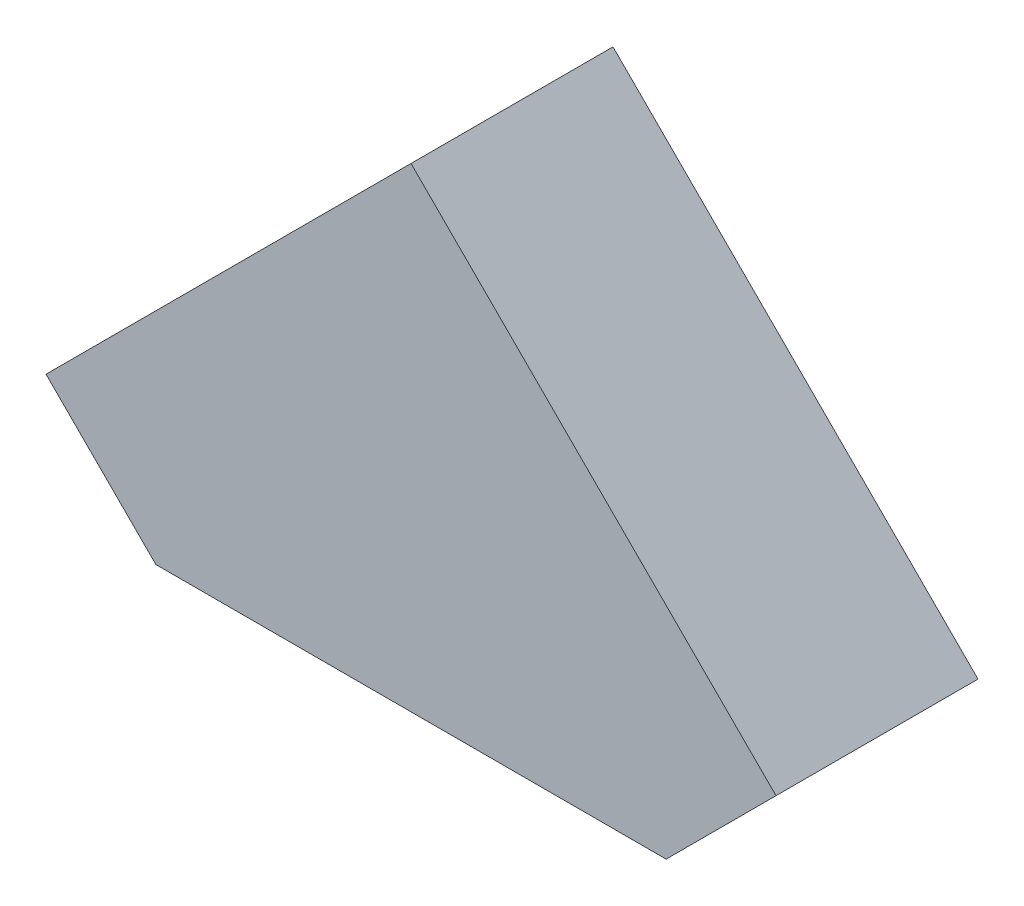
ISO-10303-21;
HEADER;
FILE_DESCRIPTION(('STEP AP214'),'2;1');
FILE_NAME('part.step','',(''),(''),'','','');
FILE_SCHEMA(('AUTOMOTIVE_DESIGN { 1 0 10303 214 1 1 1 1 }'));
ENDSEC;
DATA;
#1=APPLICATION_CONTEXT('core data for automotive mechanical design processes');
#2=APPLICATION_PROTOCOL_DEFINITION('international standard','automotive_design',2000,#1);
#3=PRODUCT_CONTEXT('',#1,'mechanical');
#4=PRODUCT('Part','Part','',(#3));
#5=PRODUCT_RELATED_PRODUCT_CATEGORY('part','',(#4));
#6=PRODUCT_DEFINITION_FORMATION('','',#4);
#7=PRODUCT_DEFINITION_CONTEXT('part definition',#1,'design');
#8=PRODUCT_DEFINITION('design','',#6,#7);
#9=PRODUCT_DEFINITION_SHAPE('','',#8);
#10=(LENGTH_UNIT() NAMED_UNIT(*) SI_UNIT(.MILLI.,.METRE.));
#11=(NAMED_UNIT(*) PLANE_ANGLE_UNIT() SI_UNIT($,.RADIAN.));
#12=(NAMED_UNIT(*) SI_UNIT($,.STERADIAN.) SOLID_ANGLE_UNIT());
#13=UNCERTAINTY_MEASURE_WITH_UNIT(LENGTH_MEASURE(1.E-05),#10,'distance_accuracy_value','');
#14=(GEOMETRIC_REPRESENTATION_CONTEXT(3) GLOBAL_UNCERTAINTY_ASSIGNED_CONTEXT((#13)) GLOBAL_UNIT_ASSIGNED_CONTEXT((#10,
#11,#12)) REPRESENTATION_CONTEXT('',''));
#15=CARTESIAN_POINT('',(0.,0.,0.));
#16=DIRECTION('',(0.,0.,1.));
#17=DIRECTION('',(1.,0.,0.));
#18=AXIS2_PLACEMENT_3D('',#15,#16,#17);
#19=CARTESIAN_POINT('',(-24.1507472573498,-6.97057308620988,-12.75));
#20=DIRECTION('',(-0.707106781186547,-0.707106781186548,0.));
#21=DIRECTION('',(0.707106781186548,-0.707106781186547,0.));
#22=AXIS2_PLACEMENT_3D('',#19,#20,#21);
#23=PLANE('',#22);
#24=DIRECTION('',(-0.707106781186548,0.707106781186547,0.));
#25=VECTOR('',#24,1.);
#26=CARTESIAN_POINT('',(-24.1507472573498,-6.97057308620988,0.));
#27=LINE('',#26,#25);
#28=CARTESIAN_POINT('',(-17.6213203435596,-13.5,0.));
#29=VERTEX_POINT('',#28);
#30=CARTESIAN_POINT('',(-25.2114074291296,-5.90991291443006,0.));
#31=VERTEX_POINT('',#30);
#32=EDGE_CURVE('E196',#29,#31,#27,.T.);
#33=ORIENTED_EDGE('',*,*,#32,.F.);
#34=DIRECTION('',(0.,0.,1.));
#35=VECTOR('',#34,1.);
#36=CARTESIAN_POINT('',(-17.6213203435596,-13.5,-12.75));
#37=LINE('',#36,#35);
#38=CARTESIAN_POINT('',(-17.6213203435596,-13.5,13.95));
#39=VERTEX_POINT('',#38);
#40=EDGE_CURVE('E209',#29,#39,#37,.T.);
#41=ORIENTED_EDGE('',*,*,#40,.T.);
#42=DIRECTION('',(0.707106781186548,-0.707106781186547,0.));
#43=VECTOR('',#42,1.);
#44=CARTESIAN_POINT('',(-25.2114074291296,-5.90991291443006,13.95));
#45=LINE('',#44,#43);
#46=CARTESIAN_POINT('',(-25.2114074291296,-5.90991291443006,13.95));
#47=VERTEX_POINT('',#46);
#48=EDGE_CURVE('E253',#47,#39,#45,.T.);
#49=ORIENTED_EDGE('',*,*,#48,.F.);
#50=DIRECTION('',(0.,0.,1.));
#51=VECTOR('',#50,1.);
#52=CARTESIAN_POINT('',(-25.2114074291296,-5.90991291443006,-12.75));
#53=LINE('',#52,#51);
#54=EDGE_CURVE('E102',#31,#47,#53,.T.);
#55=ORIENTED_EDGE('',*,*,#54,.F.);
#56=EDGE_LOOP('',(#33,#41,#49,#55));
#57=FACE_BOUND('',#56,.T.);
#58=ADVANCED_FACE('F95',(#57),#23,.T.);
#59=CARTESIAN_POINT('',(-1.06066017177982,18.2408343429197,-12.75));
#60=DIRECTION('',(-0.707106781186548,0.707106781186547,0.));
#61=DIRECTION('',(-0.707106781186547,-0.707106781186548,0.));
#62=AXIS2_PLACEMENT_3D('',#59,#60,#61);
#63=PLANE('',#62);
#64=DIRECTION('',(0.707106781186547,0.707106781186548,0.));
#65=VECTOR('',#64,1.);
#66=CARTESIAN_POINT('',(-1.06066017177982,18.2408343429197,0.));
#67=LINE('',#66,#65);
#68=CARTESIAN_POINT('',(0.,19.3014945146996,0.));
#69=VERTEX_POINT('',#68);
#70=EDGE_CURVE('E212',#31,#69,#67,.T.);
#71=ORIENTED_EDGE('',*,*,#70,.F.);
#72=ORIENTED_EDGE('',*,*,#54,.T.);
#73=DIRECTION('',(-0.707106781186547,-0.707106781186548,0.));
#74=VECTOR('',#73,1.);
#75=CARTESIAN_POINT('',(0.,19.3014945146996,13.95));
#76=LINE('',#75,#74);
#77=CARTESIAN_POINT('',(0.,19.3014945146996,13.95));
#78=VERTEX_POINT('',#77);
#79=EDGE_CURVE('E255',#78,#47,#76,.T.);
#80=ORIENTED_EDGE('',*,*,#79,.F.);
#81=DIRECTION('',(0.,0.,1.));
#82=VECTOR('',#81,1.);
#83=CARTESIAN_POINT('',(0.,19.3014945146996,-12.75));
#84=LINE('',#83,#82);
#85=EDGE_CURVE('E227',#69,#78,#84,.T.);
#86=ORIENTED_EDGE('',*,*,#85,.F.);
#87=EDGE_LOOP('',(#71,#72,#80,#86));
#88=FACE_BOUND('',#87,.T.);
#89=ADVANCED_FACE('F313',(#88),#63,.T.);
#90=CARTESIAN_POINT('',(24.1507472573498,-4.84925274265025,-12.75));
#91=DIRECTION('',(0.707106781186548,0.707106781186547,0.));
#92=DIRECTION('',(-0.707106781186547,0.707106781186548,0.));
#93=AXIS2_PLACEMENT_3D('',#90,#91,#92);
#94=PLANE('',#93);
#95=DIRECTION('',(0.707106781186547,-0.707106781186548,0.));
#96=VECTOR('',#95,1.);
#97=CARTESIAN_POINT('',(24.1507472573498,-4.84925274265025,0.));
#98=LINE('',#97,#96);
#99=CARTESIAN_POINT('',(25.2114074291296,-5.90991291443007,0.));
#100=VERTEX_POINT('',#99);
#101=EDGE_CURVE('E282',#69,#100,#98,.T.);
#102=ORIENTED_EDGE('',*,*,#101,.F.);
#103=ORIENTED_EDGE('',*,*,#85,.T.);
#104=DIRECTION('',(-0.707106781186547,0.707106781186548,0.));
#105=VECTOR('',#104,1.);
#106=CARTESIAN_POINT('',(25.2114074291296,-5.90991291443007,13.95));
#107=LINE('',#106,#105);
#108=CARTESIAN_POINT('',(25.2114074291296,-5.90991291443007,13.95));
#109=VERTEX_POINT('',#108);
#110=EDGE_CURVE('E258',#109,#78,#107,.T.);
#111=ORIENTED_EDGE('',*,*,#110,.F.);
#112=DIRECTION('',(0.,0.,1.));
#113=VECTOR('',#112,1.);
#114=CARTESIAN_POINT('',(25.2114074291296,-5.90991291443007,-12.75));
#115=LINE('',#114,#113);
#116=EDGE_CURVE('E221',#100,#109,#115,.T.);
#117=ORIENTED_EDGE('',*,*,#116,.F.);
#118=EDGE_LOOP('',(#102,#103,#111,#117));
#119=FACE_BOUND('',#118,.T.);
#120=ADVANCED_FACE('F316',(#119),#94,.T.);
#121=CARTESIAN_POINT('',(18.0606601717798,-13.0606601717798,-12.75));
#122=DIRECTION('',(0.707106781186546,-0.707106781186549,0.));
#123=DIRECTION('',(0.707106781186549,0.707106781186546,0.));
#124=AXIS2_PLACEMENT_3D('',#121,#122,#123);
#125=PLANE('',#124);
#126=DIRECTION('',(-0.707106781186549,-0.707106781186546,0.));
#127=VECTOR('',#126,1.);
#128=CARTESIAN_POINT('',(18.0606601717798,-13.0606601717798,0.));
#129=LINE('',#128,#127);
#130=CARTESIAN_POINT('',(17.6213203435596,-13.5,0.));
#131=VERTEX_POINT('',#130);
#132=EDGE_CURVE('E284',#100,#131,#129,.T.);
#133=ORIENTED_EDGE('',*,*,#132,.F.);
#134=ORIENTED_EDGE('',*,*,#116,.T.);
#135=DIRECTION('',(0.707106781186549,0.707106781186546,0.));
#136=VECTOR('',#135,1.);
#137=CARTESIAN_POINT('',(17.6213203435596,-13.5,13.95));
#138=LINE('',#137,#136);
#139=CARTESIAN_POINT('',(17.6213203435596,-13.5,13.95));
#140=VERTEX_POINT('',#139);
#141=EDGE_CURVE('E261',#140,#109,#138,.T.);
#142=ORIENTED_EDGE('',*,*,#141,.F.);
#143=DIRECTION('',(0.,0.,1.));
#144=VECTOR('',#143,1.);
#145=CARTESIAN_POINT('',(17.6213203435596,-13.5,-12.75));
#146=LINE('',#145,#144);
#147=EDGE_CURVE('E219',#131,#140,#146,.T.);
#148=ORIENTED_EDGE('',*,*,#147,.F.);
#149=EDGE_LOOP('',(#133,#134,#142,#148));
#150=FACE_BOUND('',#149,.T.);
#151=ADVANCED_FACE('F305',(#150),#125,.T.);
#152=CARTESIAN_POINT('',(-17.,-13.5,-12.75));
#153=DIRECTION('',(0.,-1.,0.));
#154=DIRECTION('',(0.,0.,-1.));
#155=AXIS2_PLACEMENT_3D('',#152,#153,#154);
#156=PLANE('',#155);
#157=DIRECTION('',(1.,0.,0.));
#158=VECTOR('',#157,1.);
#159=CARTESIAN_POINT('',(-25.2114074291296,-13.5,0.));
#160=LINE('',#159,#158);
#161=CARTESIAN_POINT('',(11.8,-13.5,0.));
#162=VERTEX_POINT('',#161);
#163=EDGE_CURVE('E204',#162,#131,#160,.T.);
#164=ORIENTED_EDGE('',*,*,#163,.T.);
#165=ORIENTED_EDGE('',*,*,#147,.T.);
#166=DIRECTION('',(1.,0.,0.));
#167=VECTOR('',#166,1.);
#168=CARTESIAN_POINT('',(-17.6213203435596,-13.5,13.95));
#169=LINE('',#168,#167);
#170=EDGE_CURVE('E218',#39,#140,#169,.T.);
#171=ORIENTED_EDGE('',*,*,#170,.F.);
#172=ORIENTED_EDGE('',*,*,#40,.F.);
#173=CARTESIAN_POINT('',(-11.8,-13.5,0.));
#174=VERTEX_POINT('',#173);
#175=EDGE_CURVE('E193',#29,#174,#160,.T.);
#176=ORIENTED_EDGE('',*,*,#175,.T.);
#177=DIRECTION('',(0.,0.,-1.));
#178=VECTOR('',#177,1.);
#179=CARTESIAN_POINT('',(-11.8,-13.5,11.8));
#180=LINE('',#179,#178);
#181=CARTESIAN_POINT('',(-11.8,-13.5,11.8));
#182=VERTEX_POINT('',#181);
#183=EDGE_CURVE('E271',#182,#174,#180,.T.);
#184=ORIENTED_EDGE('',*,*,#183,.F.);
#185=DIRECTION('',(-1.,0.,0.));
#186=VECTOR('',#185,1.);
#187=CARTESIAN_POINT('',(-11.8,-13.5,11.8));
#188=LINE('',#187,#186);
#189=CARTESIAN_POINT('',(11.8,-13.5,11.8));
#190=VERTEX_POINT('',#189);
#191=EDGE_CURVE('E274',#190,#182,#188,.T.);
#192=ORIENTED_EDGE('',*,*,#191,.F.);
#193=DIRECTION('',(0.,0.,1.));
#194=VECTOR('',#193,1.);
#195=CARTESIAN_POINT('',(11.8,-13.5,11.8));
#196=LINE('',#195,#194);
#197=EDGE_CURVE('E211',#162,#190,#196,.T.);
#198=ORIENTED_EDGE('',*,*,#197,.F.);
#199=EDGE_LOOP('',(#164,#165,#171,#172,#176,#184,#192,#198));
#200=FACE_BOUND('',#199,.T.);
#201=ADVANCED_FACE('F216',(#200),#156,.T.);
#202=CARTESIAN_POINT('',(0.,0.,13.95));
#203=DIRECTION('',(0.,0.,1.));
#204=DIRECTION('',(1.,0.,0.));
#205=AXIS2_PLACEMENT_3D('',#202,#203,#204);
#206=PLANE('',#205);
#207=ORIENTED_EDGE('',*,*,#141,.T.);
#208=ORIENTED_EDGE('',*,*,#110,.T.);
#209=ORIENTED_EDGE('',*,*,#79,.T.);
#210=ORIENTED_EDGE('',*,*,#48,.T.);
#211=ORIENTED_EDGE('',*,*,#170,.T.);
#212=EDGE_LOOP('',(#207,#208,#209,#210,#211));
#213=FACE_BOUND('',#212,.T.);
#214=ADVANCED_FACE('F309',(#213),#206,.T.);
#215=CARTESIAN_POINT('',(11.8,21.375440072005,11.8));
#216=DIRECTION('',(1.,0.,0.));
#217=DIRECTION('',(0.,0.,-1.));
#218=AXIS2_PLACEMENT_3D('',#215,#216,#217);
#219=PLANE('',#218);
#220=DIRECTION('',(0.,0.,-1.));
#221=VECTOR('',#220,1.);
#222=CARTESIAN_POINT('',(11.8,-12.,11.8));
#223=LINE('',#222,#221);
#224=CARTESIAN_POINT('',(11.8,-12.,11.8));
#225=VERTEX_POINT('',#224);
#226=CARTESIAN_POINT('',(11.8,-12.,0.));
#227=VERTEX_POINT('',#226);
#228=EDGE_CURVE('E266',#225,#227,#223,.T.);
#229=ORIENTED_EDGE('',*,*,#228,.T.);
#230=DIRECTION('',(0.,-1.,0.));
#231=VECTOR('',#230,1.);
#232=CARTESIAN_POINT('',(11.8,21.375440072005,0.));
#233=LINE('',#232,#231);
#234=EDGE_CURVE('E286',#227,#162,#233,.T.);
#235=ORIENTED_EDGE('',*,*,#234,.T.);
#236=ORIENTED_EDGE('',*,*,#197,.T.);
#237=DIRECTION('',(0.,-1.,0.));
#238=VECTOR('',#237,1.);
#239=CARTESIAN_POINT('',(11.8,21.375440072005,11.8));
#240=LINE('',#239,#238);
#241=EDGE_CURVE('E267',#225,#190,#240,.T.);
#242=ORIENTED_EDGE('',*,*,#241,.F.);
#243=EDGE_LOOP('',(#229,#235,#236,#242));
#244=FACE_BOUND('',#243,.T.);
#245=ADVANCED_FACE('F368',(#244),#219,.F.);
#246=CARTESIAN_POINT('',(-11.8,21.375440072005,11.8));
#247=DIRECTION('',(-1.,0.,0.));
#248=DIRECTION('',(0.,0.,1.));
#249=AXIS2_PLACEMENT_3D('',#246,#247,#248);
#250=PLANE('',#249);
#251=ORIENTED_EDGE('',*,*,#183,.T.);
#252=DIRECTION('',(0.,1.,0.));
#253=VECTOR('',#252,1.);
#254=CARTESIAN_POINT('',(-11.8,21.375440072005,0.));
#255=LINE('',#254,#253);
#256=CARTESIAN_POINT('',(-11.8,-12.,0.));
#257=VERTEX_POINT('',#256);
#258=EDGE_CURVE('E198',#174,#257,#255,.T.);
#259=ORIENTED_EDGE('',*,*,#258,.T.);
#260=DIRECTION('',(0.,0.,1.));
#261=VECTOR('',#260,1.);
#262=CARTESIAN_POINT('',(-11.8,-12.,11.8));
#263=LINE('',#262,#261);
#264=CARTESIAN_POINT('',(-11.8,-12.,11.8));
#265=VERTEX_POINT('',#264);
#266=EDGE_CURVE('E116',#257,#265,#263,.T.);
#267=ORIENTED_EDGE('',*,*,#266,.T.);
#268=DIRECTION('',(0.,-1.,0.));
#269=VECTOR('',#268,1.);
#270=CARTESIAN_POINT('',(-11.8,21.375440072005,11.8));
#271=LINE('',#270,#269);
#272=EDGE_CURVE('E270',#265,#182,#271,.T.);
#273=ORIENTED_EDGE('',*,*,#272,.T.);
#274=EDGE_LOOP('',(#251,#259,#267,#273));
#275=FACE_BOUND('',#274,.T.);
#276=ADVANCED_FACE('F376',(#275),#250,.F.);
#277=CARTESIAN_POINT('',(-11.8,21.375440072005,11.8));
#278=DIRECTION('',(0.,0.,1.));
#279=DIRECTION('',(1.,0.,0.));
#280=AXIS2_PLACEMENT_3D('',#277,#278,#279);
#281=PLANE('',#280);
#282=DIRECTION('',(1.,0.,0.));
#283=VECTOR('',#282,1.);
#284=CARTESIAN_POINT('',(-11.8,-12.,11.8));
#285=LINE('',#284,#283);
#286=EDGE_CURVE('E264',#265,#225,#285,.T.);
#287=ORIENTED_EDGE('',*,*,#286,.T.);
#288=ORIENTED_EDGE('',*,*,#241,.T.);
#289=ORIENTED_EDGE('',*,*,#191,.T.);
#290=ORIENTED_EDGE('',*,*,#272,.F.);
#291=EDGE_LOOP('',(#287,#288,#289,#290));
#292=FACE_BOUND('',#291,.T.);
#293=ADVANCED_FACE('F332',(#292),#281,.F.);
#294=CARTESIAN_POINT('',(-17.,-12.,-12.75));
#295=DIRECTION('',(0.,-1.,0.));
#296=DIRECTION('',(0.,0.,-1.));
#297=AXIS2_PLACEMENT_3D('',#294,#295,#296);
#298=PLANE('',#297);
#299=DIRECTION('',(0.,0.,1.));
#300=VECTOR('',#299,1.);
#301=CARTESIAN_POINT('',(17.,-12.,-12.75));
#302=LINE('',#301,#300);
#303=CARTESIAN_POINT('',(17.,-12.,0.));
#304=VERTEX_POINT('',#303);
#305=CARTESIAN_POINT('',(17.,-12.,12.75));
#306=VERTEX_POINT('',#305);
#307=EDGE_CURVE('E232',#304,#306,#302,.T.);
#308=ORIENTED_EDGE('',*,*,#307,.F.);
#309=DIRECTION('',(-1.,0.,0.));
#310=VECTOR('',#309,1.);
#311=CARTESIAN_POINT('',(-17.,-12.,0.));
#312=LINE('',#311,#310);
#313=EDGE_CURVE('E289',#304,#227,#312,.T.);
#314=ORIENTED_EDGE('',*,*,#313,.T.);
#315=ORIENTED_EDGE('',*,*,#228,.F.);
#316=ORIENTED_EDGE('',*,*,#286,.F.);
#317=ORIENTED_EDGE('',*,*,#266,.F.);
#318=CARTESIAN_POINT('',(-17.,-12.,0.));
#319=VERTEX_POINT('',#318);
#320=EDGE_CURVE('E294',#257,#319,#312,.T.);
#321=ORIENTED_EDGE('',*,*,#320,.T.);
#322=DIRECTION('',(0.,0.,1.));
#323=VECTOR('',#322,1.);
#324=CARTESIAN_POINT('',(-17.,-12.,-12.75));
#325=LINE('',#324,#323);
#326=CARTESIAN_POINT('',(-17.,-12.,12.75));
#327=VERTEX_POINT('',#326);
#328=EDGE_CURVE('E230',#319,#327,#325,.T.);
#329=ORIENTED_EDGE('',*,*,#328,.T.);
#330=DIRECTION('',(1.,0.,0.));
#331=VECTOR('',#330,1.);
#332=CARTESIAN_POINT('',(-17.,-12.,12.75));
#333=LINE('',#332,#331);
#334=EDGE_CURVE('E246',#327,#306,#333,.T.);
#335=ORIENTED_EDGE('',*,*,#334,.T.);
#336=EDGE_LOOP('',(#308,#314,#315,#316,#317,#321,#329,#335));
#337=FACE_BOUND('',#336,.T.);
#338=ADVANCED_FACE('F392',(#337),#298,.F.);
#339=CARTESIAN_POINT('',(0.,0.,12.75));
#340=DIRECTION('',(0.,0.,1.));
#341=DIRECTION('',(1.,0.,0.));
#342=AXIS2_PLACEMENT_3D('',#339,#340,#341);
#343=PLANE('',#342);
#344=ORIENTED_EDGE('',*,*,#334,.F.);
#345=DIRECTION('',(0.707106781186548,-0.707106781186547,0.));
#346=VECTOR('',#345,1.);
#347=CARTESIAN_POINT('',(-23.09008708557,-5.90991291443006,12.75));
#348=LINE('',#347,#346);
#349=CARTESIAN_POINT('',(-23.09008708557,-5.90991291443006,12.75));
#350=VERTEX_POINT('',#349);
#351=EDGE_CURVE('E249',#350,#327,#348,.T.);
#352=ORIENTED_EDGE('',*,*,#351,.F.);
#353=DIRECTION('',(-0.707106781186547,-0.707106781186548,0.));
#354=VECTOR('',#353,1.);
#355=CARTESIAN_POINT('',(0.,17.1801741711399,12.75));
#356=LINE('',#355,#354);
#357=CARTESIAN_POINT('',(0.,17.1801741711399,12.75));
#358=VERTEX_POINT('',#357);
#359=EDGE_CURVE('E233',#358,#350,#356,.T.);
#360=ORIENTED_EDGE('',*,*,#359,.F.);
#361=DIRECTION('',(-0.707106781186547,0.707106781186548,0.));
#362=VECTOR('',#361,1.);
#363=CARTESIAN_POINT('',(23.09008708557,-5.90991291443007,12.75));
#364=LINE('',#363,#362);
#365=CARTESIAN_POINT('',(23.09008708557,-5.90991291443007,12.75));
#366=VERTEX_POINT('',#365);
#367=EDGE_CURVE('E240',#366,#358,#364,.T.);
#368=ORIENTED_EDGE('',*,*,#367,.F.);
#369=DIRECTION('',(0.707106781186549,0.707106781186546,0.));
#370=VECTOR('',#369,1.);
#371=CARTESIAN_POINT('',(17.,-12.,12.75));
#372=LINE('',#371,#370);
#373=EDGE_CURVE('E243',#306,#366,#372,.T.);
#374=ORIENTED_EDGE('',*,*,#373,.F.);
#375=EDGE_LOOP('',(#344,#352,#360,#368,#374));
#376=FACE_BOUND('',#375,.T.);
#377=ADVANCED_FACE('F397',(#376),#343,.F.);
#378=CARTESIAN_POINT('',(23.09008708557,-5.90991291443007,-12.75));
#379=DIRECTION('',(0.707106781186548,0.707106781186547,0.));
#380=DIRECTION('',(-0.707106781186547,0.707106781186548,0.));
#381=AXIS2_PLACEMENT_3D('',#378,#379,#380);
#382=PLANE('',#381);
#383=DIRECTION('',(0.,0.,1.));
#384=VECTOR('',#383,1.);
#385=CARTESIAN_POINT('',(0.,17.1801741711399,-12.75));
#386=LINE('',#385,#384);
#387=CARTESIAN_POINT('',(0.,17.1801741711399,0.));
#388=VERTEX_POINT('',#387);
#389=EDGE_CURVE('E223',#388,#358,#386,.T.);
#390=ORIENTED_EDGE('',*,*,#389,.F.);
#391=DIRECTION('',(0.707106781186547,-0.707106781186548,0.));
#392=VECTOR('',#391,1.);
#393=CARTESIAN_POINT('',(23.09008708557,-5.90991291443007,0.));
#394=LINE('',#393,#392);
#395=CARTESIAN_POINT('',(23.09008708557,-5.90991291443007,0.));
#396=VERTEX_POINT('',#395);
#397=EDGE_CURVE('E109',#388,#396,#394,.T.);
#398=ORIENTED_EDGE('',*,*,#397,.T.);
#399=DIRECTION('',(0.,0.,1.));
#400=VECTOR('',#399,1.);
#401=CARTESIAN_POINT('',(23.09008708557,-5.90991291443007,-12.75));
#402=LINE('',#401,#400);
#403=EDGE_CURVE('E235',#396,#366,#402,.T.);
#404=ORIENTED_EDGE('',*,*,#403,.T.);
#405=ORIENTED_EDGE('',*,*,#367,.T.);
#406=EDGE_LOOP('',(#390,#398,#404,#405));
#407=FACE_BOUND('',#406,.T.);
#408=ADVANCED_FACE('F406',(#407),#382,.F.);
#409=CARTESIAN_POINT('',(17.,-12.,-12.75));
#410=DIRECTION('',(0.707106781186546,-0.707106781186549,0.));
#411=DIRECTION('',(0.707106781186549,0.707106781186546,0.));
#412=AXIS2_PLACEMENT_3D('',#409,#410,#411);
#413=PLANE('',#412);
#414=ORIENTED_EDGE('',*,*,#403,.F.);
#415=DIRECTION('',(-0.707106781186549,-0.707106781186546,0.));
#416=VECTOR('',#415,1.);
#417=CARTESIAN_POINT('',(17.,-12.,0.));
#418=LINE('',#417,#416);
#419=EDGE_CURVE('E290',#396,#304,#418,.T.);
#420=ORIENTED_EDGE('',*,*,#419,.T.);
#421=ORIENTED_EDGE('',*,*,#307,.T.);
#422=ORIENTED_EDGE('',*,*,#373,.T.);
#423=EDGE_LOOP('',(#414,#420,#421,#422));
#424=FACE_BOUND('',#423,.T.);
#425=ADVANCED_FACE('F414',(#424),#413,.F.);
#426=CARTESIAN_POINT('',(-23.09008708557,-5.90991291443006,-12.75));
#427=DIRECTION('',(-0.707106781186547,-0.707106781186548,0.));
#428=DIRECTION('',(0.707106781186548,-0.707106781186547,0.));
#429=AXIS2_PLACEMENT_3D('',#426,#427,#428);
#430=PLANE('',#429);
#431=ORIENTED_EDGE('',*,*,#328,.F.);
#432=DIRECTION('',(-0.707106781186548,0.707106781186547,0.));
#433=VECTOR('',#432,1.);
#434=CARTESIAN_POINT('',(-23.09008708557,-5.90991291443006,0.));
#435=LINE('',#434,#433);
#436=CARTESIAN_POINT('',(-23.09008708557,-5.90991291443006,0.));
#437=VERTEX_POINT('',#436);
#438=EDGE_CURVE('E203',#319,#437,#435,.T.);
#439=ORIENTED_EDGE('',*,*,#438,.T.);
#440=DIRECTION('',(0.,0.,1.));
#441=VECTOR('',#440,1.);
#442=CARTESIAN_POINT('',(-23.09008708557,-5.90991291443006,-12.75));
#443=LINE('',#442,#441);
#444=EDGE_CURVE('E220',#437,#350,#443,.T.);
#445=ORIENTED_EDGE('',*,*,#444,.T.);
#446=ORIENTED_EDGE('',*,*,#351,.T.);
#447=EDGE_LOOP('',(#431,#439,#445,#446));
#448=FACE_BOUND('',#447,.T.);
#449=ADVANCED_FACE('F425',(#448),#430,.F.);
#450=CARTESIAN_POINT('',(0.,17.1801741711399,-12.75));
#451=DIRECTION('',(-0.707106781186548,0.707106781186547,0.));
#452=DIRECTION('',(-0.707106781186547,-0.707106781186548,0.));
#453=AXIS2_PLACEMENT_3D('',#450,#451,#452);
#454=PLANE('',#453);
#455=ORIENTED_EDGE('',*,*,#444,.F.);
#456=DIRECTION('',(0.707106781186547,0.707106781186548,0.));
#457=VECTOR('',#456,1.);
#458=CARTESIAN_POINT('',(0.,17.1801741711399,0.));
#459=LINE('',#458,#457);
#460=EDGE_CURVE('E12',#437,#388,#459,.T.);
#461=ORIENTED_EDGE('',*,*,#460,.T.);
#462=ORIENTED_EDGE('',*,*,#389,.T.);
#463=ORIENTED_EDGE('',*,*,#359,.T.);
#464=EDGE_LOOP('',(#455,#461,#462,#463));
#465=FACE_BOUND('',#464,.T.);
#466=ADVANCED_FACE('F436',(#465),#454,.F.);
#467=CARTESIAN_POINT('',(-25.2114074291296,19.3014945146996,0.));
#468=DIRECTION('',(0.,0.,1.));
#469=DIRECTION('',(1.,0.,0.));
#470=AXIS2_PLACEMENT_3D('',#467,#468,#469);
#471=PLANE('',#470);
#472=ORIENTED_EDGE('',*,*,#32,.T.);
#473=ORIENTED_EDGE('',*,*,#70,.T.);
#474=ORIENTED_EDGE('',*,*,#101,.T.);
#475=ORIENTED_EDGE('',*,*,#132,.T.);
#476=ORIENTED_EDGE('',*,*,#163,.F.);
#477=ORIENTED_EDGE('',*,*,#234,.F.);
#478=ORIENTED_EDGE('',*,*,#313,.F.);
#479=ORIENTED_EDGE('',*,*,#419,.F.);
#480=ORIENTED_EDGE('',*,*,#397,.F.);
#481=ORIENTED_EDGE('',*,*,#460,.F.);
#482=ORIENTED_EDGE('',*,*,#438,.F.);
#483=ORIENTED_EDGE('',*,*,#320,.F.);
#484=ORIENTED_EDGE('',*,*,#258,.F.);
#485=ORIENTED_EDGE('',*,*,#175,.F.);
#486=EDGE_LOOP('',(#472,#473,#474,#475,#476,#477,#478,#479,#480,#481,#482,#483,#484,#485));
#487=FACE_BOUND('',#486,.T.);
#488=ADVANCED_FACE('F195',(#487),#471,.F.);
#489=CLOSED_SHELL('',(#58,#89,#120,#151,#201,#214,#245,#276,#293,#338,#377,#408,#425,#449,#466,#488));
#490=MANIFOLD_SOLID_BREP('B2',#489);
#491=ADVANCED_BREP_SHAPE_REPRESENTATION('',(#18,#490),#14);
#492=SHAPE_DEFINITION_REPRESENTATION(#9,#491);
ENDSEC;
END-ISO-10303-21;
